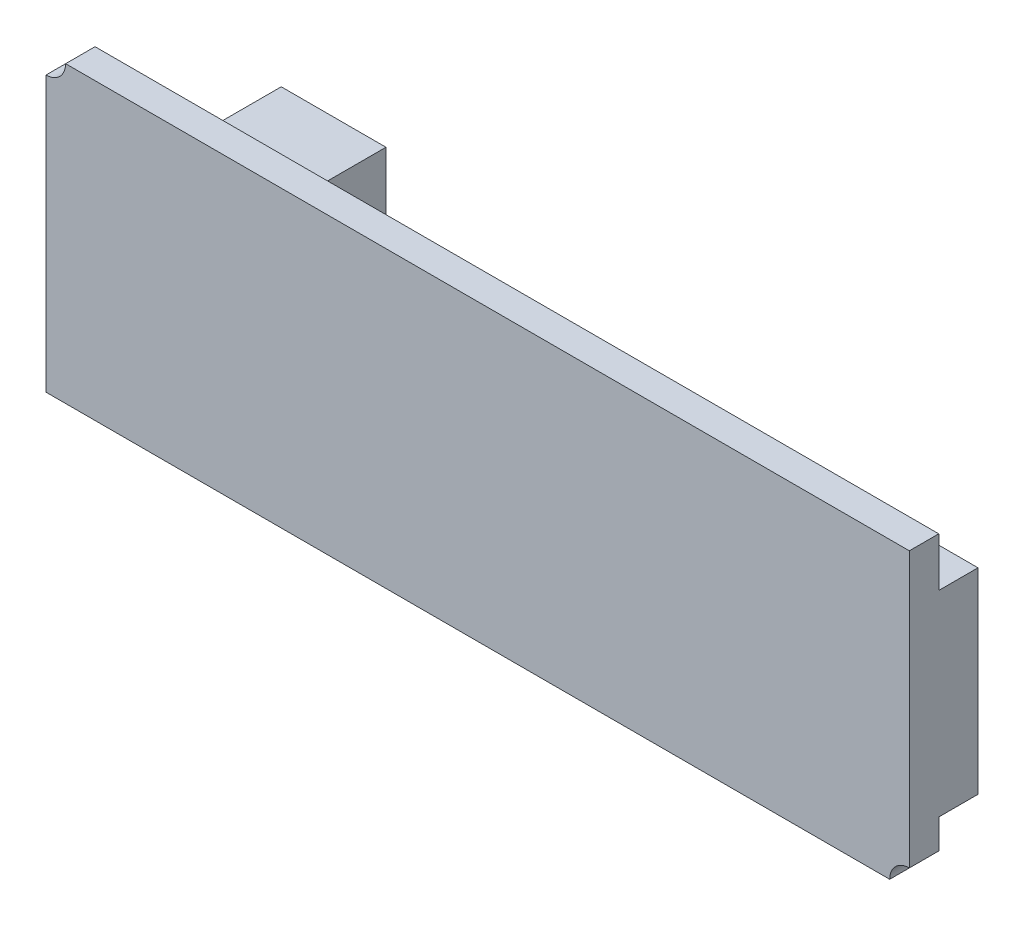
ISO-10303-21;
HEADER;
FILE_DESCRIPTION(('STEP AP214'),'2;1');
FILE_NAME('part.step','',(''),(''),'','','');
FILE_SCHEMA(('AUTOMOTIVE_DESIGN { 1 0 10303 214 1 1 1 1 }'));
ENDSEC;
DATA;
#1=APPLICATION_CONTEXT('core data for automotive mechanical design processes');
#2=APPLICATION_PROTOCOL_DEFINITION('international standard','automotive_design',2000,#1);
#3=PRODUCT_CONTEXT('',#1,'mechanical');
#4=PRODUCT('Part','Part','',(#3));
#5=PRODUCT_RELATED_PRODUCT_CATEGORY('part','',(#4));
#6=PRODUCT_DEFINITION_FORMATION('','',#4);
#7=PRODUCT_DEFINITION_CONTEXT('part definition',#1,'design');
#8=PRODUCT_DEFINITION('design','',#6,#7);
#9=PRODUCT_DEFINITION_SHAPE('','',#8);
#10=(LENGTH_UNIT() NAMED_UNIT(*) SI_UNIT(.MILLI.,.METRE.));
#11=(NAMED_UNIT(*) PLANE_ANGLE_UNIT() SI_UNIT($,.RADIAN.));
#12=(NAMED_UNIT(*) SI_UNIT($,.STERADIAN.) SOLID_ANGLE_UNIT());
#13=UNCERTAINTY_MEASURE_WITH_UNIT(LENGTH_MEASURE(1.E-05),#10,'distance_accuracy_value','');
#14=(GEOMETRIC_REPRESENTATION_CONTEXT(3) GLOBAL_UNCERTAINTY_ASSIGNED_CONTEXT((#13)) GLOBAL_UNIT_ASSIGNED_CONTEXT((#10,
#11,#12)) REPRESENTATION_CONTEXT('',''));
#15=CARTESIAN_POINT('',(0.,0.,0.));
#16=DIRECTION('',(0.,0.,1.));
#17=DIRECTION('',(1.,0.,0.));
#18=AXIS2_PLACEMENT_3D('',#15,#16,#17);
#19=CARTESIAN_POINT('',(0.,0.,1.5));
#20=DIRECTION('',(1.,0.,0.));
#21=DIRECTION('',(0.,0.,-1.));
#22=AXIS2_PLACEMENT_3D('',#19,#20,#21);
#23=PLANE('',#22);
#24=DIRECTION('',(0.,-1.,0.));
#25=VECTOR('',#24,1.);
#26=CARTESIAN_POINT('',(0.,0.,1.5));
#27=LINE('',#26,#25);
#28=CARTESIAN_POINT('',(0.,14.,1.5));
#29=VERTEX_POINT('',#28);
#30=CARTESIAN_POINT('',(0.,0.,1.5));
#31=VERTEX_POINT('',#30);
#32=EDGE_CURVE('E230',#29,#31,#27,.T.);
#33=ORIENTED_EDGE('',*,*,#32,.F.);
#34=DIRECTION('',(0.,0.,1.));
#35=VECTOR('',#34,1.);
#36=CARTESIAN_POINT('',(0.,14.,-2.001));
#37=LINE('',#36,#35);
#38=CARTESIAN_POINT('',(0.,14.,0.));
#39=VERTEX_POINT('',#38);
#40=EDGE_CURVE('E197',#39,#29,#37,.T.);
#41=ORIENTED_EDGE('',*,*,#40,.F.);
#42=DIRECTION('',(0.,-1.,0.));
#43=VECTOR('',#42,1.);
#44=CARTESIAN_POINT('',(0.,0.,0.));
#45=LINE('',#44,#43);
#46=CARTESIAN_POINT('',(0.,0.,0.));
#47=VERTEX_POINT('',#46);
#48=EDGE_CURVE('E229',#39,#47,#45,.T.);
#49=ORIENTED_EDGE('',*,*,#48,.T.);
#50=DIRECTION('',(0.,0.,-1.));
#51=VECTOR('',#50,1.);
#52=CARTESIAN_POINT('',(0.,0.,1.5));
#53=LINE('',#52,#51);
#54=EDGE_CURVE('E11',#31,#47,#53,.T.);
#55=ORIENTED_EDGE('',*,*,#54,.F.);
#56=EDGE_LOOP('',(#33,#41,#49,#55));
#57=FACE_BOUND('',#56,.T.);
#58=ADVANCED_FACE('F45',(#57),#23,.F.);
#59=CARTESIAN_POINT('',(0.,0.,1.5));
#60=DIRECTION('',(0.,1.,0.));
#61=DIRECTION('',(0.,0.,1.));
#62=AXIS2_PLACEMENT_3D('',#59,#60,#61);
#63=PLANE('',#62);
#64=DIRECTION('',(1.,0.,0.));
#65=VECTOR('',#64,1.);
#66=CARTESIAN_POINT('',(0.,0.,0.));
#67=LINE('',#66,#65);
#68=CARTESIAN_POINT('',(43.,0.,0.));
#69=VERTEX_POINT('',#68);
#70=EDGE_CURVE('E242',#47,#69,#67,.T.);
#71=ORIENTED_EDGE('',*,*,#70,.T.);
#72=DIRECTION('',(0.,0.,1.));
#73=VECTOR('',#72,1.);
#74=CARTESIAN_POINT('',(43.,0.,-2.001));
#75=LINE('',#74,#73);
#76=CARTESIAN_POINT('',(43.,0.,1.5));
#77=VERTEX_POINT('',#76);
#78=EDGE_CURVE('E186',#77,#69,#75,.F.);
#79=ORIENTED_EDGE('',*,*,#78,.F.);
#80=DIRECTION('',(1.,0.,0.));
#81=VECTOR('',#80,1.);
#82=CARTESIAN_POINT('',(0.,0.,1.5));
#83=LINE('',#82,#81);
#84=EDGE_CURVE('E232',#31,#77,#83,.T.);
#85=ORIENTED_EDGE('',*,*,#84,.F.);
#86=ORIENTED_EDGE('',*,*,#54,.T.);
#87=EDGE_LOOP('',(#71,#79,#85,#86));
#88=FACE_BOUND('',#87,.T.);
#89=ADVANCED_FACE('F273',(#88),#63,.F.);
#90=CARTESIAN_POINT('',(44.,0.,1.5));
#91=DIRECTION('',(-1.,0.,0.));
#92=DIRECTION('',(0.,0.,1.));
#93=AXIS2_PLACEMENT_3D('',#90,#91,#92);
#94=PLANE('',#93);
#95=DIRECTION('',(0.,1.,0.));
#96=VECTOR('',#95,1.);
#97=CARTESIAN_POINT('',(44.,0.,1.5));
#98=LINE('',#97,#96);
#99=CARTESIAN_POINT('',(44.,0.999999999999998,1.5));
#100=VERTEX_POINT('',#99);
#101=CARTESIAN_POINT('',(44.,15.,1.5));
#102=VERTEX_POINT('',#101);
#103=EDGE_CURVE('E236',#100,#102,#98,.T.);
#104=ORIENTED_EDGE('',*,*,#103,.F.);
#105=DIRECTION('',(0.,0.,1.));
#106=VECTOR('',#105,1.);
#107=CARTESIAN_POINT('',(44.,0.999999999999998,-2.001));
#108=LINE('',#107,#106);
#109=CARTESIAN_POINT('',(44.,0.999999999999998,0.));
#110=VERTEX_POINT('',#109);
#111=EDGE_CURVE('E184',#110,#100,#108,.T.);
#112=ORIENTED_EDGE('',*,*,#111,.F.);
#113=DIRECTION('',(0.,1.,0.));
#114=VECTOR('',#113,1.);
#115=CARTESIAN_POINT('',(44.,0.,0.));
#116=LINE('',#115,#114);
#117=CARTESIAN_POINT('',(44.,2.5,0.));
#118=VERTEX_POINT('',#117);
#119=EDGE_CURVE('E246',#110,#118,#116,.T.);
#120=ORIENTED_EDGE('',*,*,#119,.T.);
#121=DIRECTION('',(0.,0.,1.));
#122=VECTOR('',#121,1.);
#123=CARTESIAN_POINT('',(44.,2.5,-2.));
#124=LINE('',#123,#122);
#125=CARTESIAN_POINT('',(44.,2.5,-2.));
#126=VERTEX_POINT('',#125);
#127=EDGE_CURVE('E226',#126,#118,#124,.T.);
#128=ORIENTED_EDGE('',*,*,#127,.F.);
#129=DIRECTION('',(0.,-1.,0.));
#130=VECTOR('',#129,1.);
#131=CARTESIAN_POINT('',(44.,12.5,-2.));
#132=LINE('',#131,#130);
#133=CARTESIAN_POINT('',(44.,12.5,-2.));
#134=VERTEX_POINT('',#133);
#135=EDGE_CURVE('E200',#134,#126,#132,.T.);
#136=ORIENTED_EDGE('',*,*,#135,.F.);
#137=DIRECTION('',(0.,0.,1.));
#138=VECTOR('',#137,1.);
#139=CARTESIAN_POINT('',(44.,12.5,-2.));
#140=LINE('',#139,#138);
#141=CARTESIAN_POINT('',(44.,12.5,0.));
#142=VERTEX_POINT('',#141);
#143=EDGE_CURVE('E210',#134,#142,#140,.T.);
#144=ORIENTED_EDGE('',*,*,#143,.T.);
#145=CARTESIAN_POINT('',(44.,15.,0.));
#146=VERTEX_POINT('',#145);
#147=EDGE_CURVE('E245',#142,#146,#116,.T.);
#148=ORIENTED_EDGE('',*,*,#147,.T.);
#149=DIRECTION('',(0.,0.,-1.));
#150=VECTOR('',#149,1.);
#151=CARTESIAN_POINT('',(44.,15.,1.5));
#152=LINE('',#151,#150);
#153=EDGE_CURVE('E52',#102,#146,#152,.T.);
#154=ORIENTED_EDGE('',*,*,#153,.F.);
#155=EDGE_LOOP('',(#104,#112,#120,#128,#136,#144,#148,#154));
#156=FACE_BOUND('',#155,.T.);
#157=ADVANCED_FACE('F280',(#156),#94,.F.);
#158=CARTESIAN_POINT('',(0.,15.,1.5));
#159=DIRECTION('',(0.,-1.,0.));
#160=DIRECTION('',(0.,0.,-1.));
#161=AXIS2_PLACEMENT_3D('',#158,#159,#160);
#162=PLANE('',#161);
#163=DIRECTION('',(-1.,0.,0.));
#164=VECTOR('',#163,1.);
#165=CARTESIAN_POINT('',(0.,15.,0.));
#166=LINE('',#165,#164);
#167=CARTESIAN_POINT('',(1.,15.,0.));
#168=VERTEX_POINT('',#167);
#169=EDGE_CURVE('E233',#146,#168,#166,.T.);
#170=ORIENTED_EDGE('',*,*,#169,.T.);
#171=DIRECTION('',(0.,0.,1.));
#172=VECTOR('',#171,1.);
#173=CARTESIAN_POINT('',(1.,15.,-2.001));
#174=LINE('',#173,#172);
#175=CARTESIAN_POINT('',(1.,15.,1.5));
#176=VERTEX_POINT('',#175);
#177=EDGE_CURVE('E67',#176,#168,#174,.F.);
#178=ORIENTED_EDGE('',*,*,#177,.F.);
#179=DIRECTION('',(-1.,0.,0.));
#180=VECTOR('',#179,1.);
#181=CARTESIAN_POINT('',(0.,15.,1.5));
#182=LINE('',#181,#180);
#183=EDGE_CURVE('E238',#102,#176,#182,.T.);
#184=ORIENTED_EDGE('',*,*,#183,.F.);
#185=ORIENTED_EDGE('',*,*,#153,.T.);
#186=EDGE_LOOP('',(#170,#178,#184,#185));
#187=FACE_BOUND('',#186,.T.);
#188=ADVANCED_FACE('F254',(#187),#162,.F.);
#189=CARTESIAN_POINT('',(0.,0.,1.5));
#190=DIRECTION('',(0.,0.,-1.));
#191=DIRECTION('',(-1.,0.,0.));
#192=AXIS2_PLACEMENT_3D('',#189,#190,#191);
#193=PLANE('',#192);
#194=ORIENTED_EDGE('',*,*,#84,.T.);
#195=CARTESIAN_POINT('',(44.,0.,1.5));
#196=DIRECTION('',(0.,0.,1.));
#197=DIRECTION('',(1.,0.,0.));
#198=AXIS2_PLACEMENT_3D('',#195,#196,#197);
#199=CIRCLE('',#198,0.999999999999998);
#200=EDGE_CURVE('E188',#100,#77,#199,.T.);
#201=ORIENTED_EDGE('',*,*,#200,.F.);
#202=ORIENTED_EDGE('',*,*,#103,.T.);
#203=ORIENTED_EDGE('',*,*,#183,.T.);
#204=CARTESIAN_POINT('',(0.,15.,1.5));
#205=DIRECTION('',(0.,0.,1.));
#206=DIRECTION('',(1.,0.,0.));
#207=AXIS2_PLACEMENT_3D('',#204,#205,#206);
#208=CIRCLE('',#207,1.);
#209=EDGE_CURVE('E195',#29,#176,#208,.T.);
#210=ORIENTED_EDGE('',*,*,#209,.F.);
#211=ORIENTED_EDGE('',*,*,#32,.T.);
#212=EDGE_LOOP('',(#194,#201,#202,#203,#210,#211));
#213=FACE_BOUND('',#212,.T.);
#214=ADVANCED_FACE('F269',(#213),#193,.F.);
#215=CARTESIAN_POINT('',(0.,0.,0.));
#216=DIRECTION('',(0.,0.,-1.));
#217=DIRECTION('',(-1.,0.,0.));
#218=AXIS2_PLACEMENT_3D('',#215,#216,#217);
#219=PLANE('',#218);
#220=DIRECTION('',(1.,0.,0.));
#221=VECTOR('',#220,1.);
#222=CARTESIAN_POINT('',(4.48921183664197,2.82929884240524,0.));
#223=LINE('',#222,#221);
#224=CARTESIAN_POINT('',(4.48921183664197,2.82929884240524,0.));
#225=VERTEX_POINT('',#224);
#226=CARTESIAN_POINT('',(9.82587689526326,2.82929884240524,0.));
#227=VERTEX_POINT('',#226);
#228=EDGE_CURVE('E175',#225,#227,#223,.T.);
#229=ORIENTED_EDGE('',*,*,#228,.T.);
#230=DIRECTION('',(0.,-1.,0.));
#231=VECTOR('',#230,1.);
#232=CARTESIAN_POINT('',(9.82587689526326,11.9753104794338,0.));
#233=LINE('',#232,#231);
#234=CARTESIAN_POINT('',(9.82587689526326,11.9753104794338,0.));
#235=VERTEX_POINT('',#234);
#236=EDGE_CURVE('E159',#235,#227,#233,.T.);
#237=ORIENTED_EDGE('',*,*,#236,.F.);
#238=DIRECTION('',(1.,0.,0.));
#239=VECTOR('',#238,1.);
#240=CARTESIAN_POINT('',(4.48921183664197,11.9753104794338,0.));
#241=LINE('',#240,#239);
#242=CARTESIAN_POINT('',(4.48921183664197,11.9753104794338,0.));
#243=VERTEX_POINT('',#242);
#244=EDGE_CURVE('E170',#243,#235,#241,.T.);
#245=ORIENTED_EDGE('',*,*,#244,.F.);
#246=DIRECTION('',(0.,-1.,0.));
#247=VECTOR('',#246,1.);
#248=CARTESIAN_POINT('',(4.48921183664197,11.9753104794338,0.));
#249=LINE('',#248,#247);
#250=EDGE_CURVE('E167',#243,#225,#249,.T.);
#251=ORIENTED_EDGE('',*,*,#250,.T.);
#252=EDGE_LOOP('',(#229,#237,#245,#251));
#253=FACE_BOUND('',#252,.T.);
#254=CARTESIAN_POINT('',(44.,0.,0.));
#255=DIRECTION('',(0.,0.,-1.));
#256=DIRECTION('',(-1.,0.,0.));
#257=AXIS2_PLACEMENT_3D('',#254,#255,#256);
#258=CIRCLE('',#257,0.999999999999998);
#259=EDGE_CURVE('E190',#110,#69,#258,.F.);
#260=ORIENTED_EDGE('',*,*,#259,.T.);
#261=ORIENTED_EDGE('',*,*,#70,.F.);
#262=ORIENTED_EDGE('',*,*,#48,.F.);
#263=CARTESIAN_POINT('',(0.,15.,0.));
#264=DIRECTION('',(0.,0.,-1.));
#265=DIRECTION('',(-1.,0.,0.));
#266=AXIS2_PLACEMENT_3D('',#263,#264,#265);
#267=CIRCLE('',#266,1.);
#268=EDGE_CURVE('E180',#39,#168,#267,.F.);
#269=ORIENTED_EDGE('',*,*,#268,.T.);
#270=ORIENTED_EDGE('',*,*,#169,.F.);
#271=ORIENTED_EDGE('',*,*,#147,.F.);
#272=DIRECTION('',(1.,0.,0.));
#273=VECTOR('',#272,1.);
#274=CARTESIAN_POINT('',(44.,12.5,0.));
#275=LINE('',#274,#273);
#276=CARTESIAN_POINT('',(38.,12.5,0.));
#277=VERTEX_POINT('',#276);
#278=EDGE_CURVE('E204',#277,#142,#275,.T.);
#279=ORIENTED_EDGE('',*,*,#278,.F.);
#280=DIRECTION('',(0.,1.,0.));
#281=VECTOR('',#280,1.);
#282=CARTESIAN_POINT('',(38.,12.5,0.));
#283=LINE('',#282,#281);
#284=CARTESIAN_POINT('',(38.,2.5,0.));
#285=VERTEX_POINT('',#284);
#286=EDGE_CURVE('E213',#285,#277,#283,.T.);
#287=ORIENTED_EDGE('',*,*,#286,.F.);
#288=DIRECTION('',(-1.,0.,0.));
#289=VECTOR('',#288,1.);
#290=CARTESIAN_POINT('',(44.,2.5,0.));
#291=LINE('',#290,#289);
#292=EDGE_CURVE('E193',#118,#285,#291,.T.);
#293=ORIENTED_EDGE('',*,*,#292,.F.);
#294=ORIENTED_EDGE('',*,*,#119,.F.);
#295=EDGE_LOOP('',(#260,#261,#262,#269,#270,#271,#279,#287,#293,#294));
#296=FACE_BOUND('',#295,.T.);
#297=ADVANCED_FACE('F258',(#253,#296),#219,.T.);
#298=CARTESIAN_POINT('',(44.,2.5,-2.));
#299=DIRECTION('',(0.,1.,0.));
#300=DIRECTION('',(0.,0.,1.));
#301=AXIS2_PLACEMENT_3D('',#298,#299,#300);
#302=PLANE('',#301);
#303=ORIENTED_EDGE('',*,*,#292,.T.);
#304=DIRECTION('',(0.,0.,1.));
#305=VECTOR('',#304,1.);
#306=CARTESIAN_POINT('',(38.,2.5,-2.));
#307=LINE('',#306,#305);
#308=CARTESIAN_POINT('',(38.,2.5,-2.));
#309=VERTEX_POINT('',#308);
#310=EDGE_CURVE('E223',#309,#285,#307,.T.);
#311=ORIENTED_EDGE('',*,*,#310,.F.);
#312=DIRECTION('',(-1.,0.,0.));
#313=VECTOR('',#312,1.);
#314=CARTESIAN_POINT('',(44.,2.5,-2.));
#315=LINE('',#314,#313);
#316=EDGE_CURVE('E203',#126,#309,#315,.T.);
#317=ORIENTED_EDGE('',*,*,#316,.F.);
#318=ORIENTED_EDGE('',*,*,#127,.T.);
#319=EDGE_LOOP('',(#303,#311,#317,#318));
#320=FACE_BOUND('',#319,.T.);
#321=ADVANCED_FACE('F283',(#320),#302,.F.);
#322=CARTESIAN_POINT('',(38.,12.5,-2.));
#323=DIRECTION('',(1.,0.,0.));
#324=DIRECTION('',(0.,0.,-1.));
#325=AXIS2_PLACEMENT_3D('',#322,#323,#324);
#326=PLANE('',#325);
#327=ORIENTED_EDGE('',*,*,#286,.T.);
#328=DIRECTION('',(0.,0.,1.));
#329=VECTOR('',#328,1.);
#330=CARTESIAN_POINT('',(38.,12.5,-2.));
#331=LINE('',#330,#329);
#332=CARTESIAN_POINT('',(38.,12.5,-2.));
#333=VERTEX_POINT('',#332);
#334=EDGE_CURVE('E220',#333,#277,#331,.T.);
#335=ORIENTED_EDGE('',*,*,#334,.F.);
#336=DIRECTION('',(0.,1.,0.));
#337=VECTOR('',#336,1.);
#338=CARTESIAN_POINT('',(38.,12.5,-2.));
#339=LINE('',#338,#337);
#340=EDGE_CURVE('E206',#309,#333,#339,.T.);
#341=ORIENTED_EDGE('',*,*,#340,.F.);
#342=ORIENTED_EDGE('',*,*,#310,.T.);
#343=EDGE_LOOP('',(#327,#335,#341,#342));
#344=FACE_BOUND('',#343,.T.);
#345=ADVANCED_FACE('F294',(#344),#326,.F.);
#346=CARTESIAN_POINT('',(44.,12.5,-2.));
#347=DIRECTION('',(0.,-1.,0.));
#348=DIRECTION('',(0.,0.,-1.));
#349=AXIS2_PLACEMENT_3D('',#346,#347,#348);
#350=PLANE('',#349);
#351=ORIENTED_EDGE('',*,*,#278,.T.);
#352=ORIENTED_EDGE('',*,*,#143,.F.);
#353=DIRECTION('',(1.,0.,0.));
#354=VECTOR('',#353,1.);
#355=CARTESIAN_POINT('',(44.,12.5,-2.));
#356=LINE('',#355,#354);
#357=EDGE_CURVE('E208',#333,#134,#356,.T.);
#358=ORIENTED_EDGE('',*,*,#357,.F.);
#359=ORIENTED_EDGE('',*,*,#334,.T.);
#360=EDGE_LOOP('',(#351,#352,#358,#359));
#361=FACE_BOUND('',#360,.T.);
#362=ADVANCED_FACE('F292',(#361),#350,.F.);
#363=CARTESIAN_POINT('',(0.,0.,-2.));
#364=DIRECTION('',(0.,0.,-1.));
#365=DIRECTION('',(-1.,0.,0.));
#366=AXIS2_PLACEMENT_3D('',#363,#364,#365);
#367=PLANE('',#366);
#368=ORIENTED_EDGE('',*,*,#135,.T.);
#369=ORIENTED_EDGE('',*,*,#316,.T.);
#370=ORIENTED_EDGE('',*,*,#340,.T.);
#371=ORIENTED_EDGE('',*,*,#357,.T.);
#372=EDGE_LOOP('',(#368,#369,#370,#371));
#373=FACE_BOUND('',#372,.T.);
#374=ADVANCED_FACE('F287',(#373),#367,.T.);
#375=CARTESIAN_POINT('',(0.,15.,-2.001));
#376=DIRECTION('',(0.,0.,1.));
#377=DIRECTION('',(1.,0.,0.));
#378=AXIS2_PLACEMENT_3D('',#375,#376,#377);
#379=CYLINDRICAL_SURFACE('',#378,1.);
#380=ORIENTED_EDGE('',*,*,#40,.T.);
#381=ORIENTED_EDGE('',*,*,#209,.T.);
#382=ORIENTED_EDGE('',*,*,#177,.T.);
#383=ORIENTED_EDGE('',*,*,#268,.F.);
#384=EDGE_LOOP('',(#380,#381,#382,#383));
#385=FACE_BOUND('',#384,.T.);
#386=ADVANCED_FACE('F262',(#385),#379,.F.);
#387=CARTESIAN_POINT('',(44.,0.,-2.001));
#388=DIRECTION('',(0.,0.,1.));
#389=DIRECTION('',(1.,0.,0.));
#390=AXIS2_PLACEMENT_3D('',#387,#388,#389);
#391=CYLINDRICAL_SURFACE('',#390,0.999999999999998);
#392=ORIENTED_EDGE('',*,*,#78,.T.);
#393=ORIENTED_EDGE('',*,*,#259,.F.);
#394=ORIENTED_EDGE('',*,*,#111,.T.);
#395=ORIENTED_EDGE('',*,*,#200,.T.);
#396=EDGE_LOOP('',(#392,#393,#394,#395));
#397=FACE_BOUND('',#396,.T.);
#398=ADVANCED_FACE('F275',(#397),#391,.F.);
#399=CARTESIAN_POINT('',(4.48921183664197,2.82929884240524,-6.));
#400=DIRECTION('',(0.,-1.,0.));
#401=DIRECTION('',(0.,0.,-1.));
#402=AXIS2_PLACEMENT_3D('',#399,#400,#401);
#403=PLANE('',#402);
#404=ORIENTED_EDGE('',*,*,#228,.F.);
#405=DIRECTION('',(0.,0.,1.));
#406=VECTOR('',#405,1.);
#407=CARTESIAN_POINT('',(4.48921183664197,2.82929884240524,-6.));
#408=LINE('',#407,#406);
#409=CARTESIAN_POINT('',(4.48921183664197,2.82929884240524,-6.));
#410=VERTEX_POINT('',#409);
#411=EDGE_CURVE('E166',#410,#225,#408,.T.);
#412=ORIENTED_EDGE('',*,*,#411,.F.);
#413=DIRECTION('',(1.,0.,0.));
#414=VECTOR('',#413,1.);
#415=CARTESIAN_POINT('',(4.48921183664197,2.82929884240524,-6.));
#416=LINE('',#415,#414);
#417=CARTESIAN_POINT('',(9.82587689526326,2.82929884240524,-6.));
#418=VERTEX_POINT('',#417);
#419=EDGE_CURVE('E151',#410,#418,#416,.T.);
#420=ORIENTED_EDGE('',*,*,#419,.T.);
#421=DIRECTION('',(0.,0.,1.));
#422=VECTOR('',#421,1.);
#423=CARTESIAN_POINT('',(9.82587689526326,2.82929884240524,-6.));
#424=LINE('',#423,#422);
#425=EDGE_CURVE('E156',#418,#227,#424,.T.);
#426=ORIENTED_EDGE('',*,*,#425,.T.);
#427=EDGE_LOOP('',(#404,#412,#420,#426));
#428=FACE_BOUND('',#427,.T.);
#429=ADVANCED_FACE('F165',(#428),#403,.T.);
#430=CARTESIAN_POINT('',(4.48921183664197,11.9753104794338,-6.));
#431=DIRECTION('',(-1.,0.,0.));
#432=DIRECTION('',(0.,0.,1.));
#433=AXIS2_PLACEMENT_3D('',#430,#431,#432);
#434=PLANE('',#433);
#435=ORIENTED_EDGE('',*,*,#250,.F.);
#436=DIRECTION('',(0.,0.,1.));
#437=VECTOR('',#436,1.);
#438=CARTESIAN_POINT('',(4.48921183664197,11.9753104794338,-6.));
#439=LINE('',#438,#437);
#440=CARTESIAN_POINT('',(4.48921183664197,11.9753104794338,-6.));
#441=VERTEX_POINT('',#440);
#442=EDGE_CURVE('E181',#441,#243,#439,.T.);
#443=ORIENTED_EDGE('',*,*,#442,.F.);
#444=DIRECTION('',(0.,-1.,0.));
#445=VECTOR('',#444,1.);
#446=CARTESIAN_POINT('',(4.48921183664197,11.9753104794338,-6.));
#447=LINE('',#446,#445);
#448=EDGE_CURVE('E163',#441,#410,#447,.T.);
#449=ORIENTED_EDGE('',*,*,#448,.T.);
#450=ORIENTED_EDGE('',*,*,#411,.T.);
#451=EDGE_LOOP('',(#435,#443,#449,#450));
#452=FACE_BOUND('',#451,.T.);
#453=ADVANCED_FACE('F351',(#452),#434,.T.);
#454=CARTESIAN_POINT('',(4.48921183664197,11.9753104794338,-6.));
#455=DIRECTION('',(0.,-1.,0.));
#456=DIRECTION('',(0.,0.,-1.));
#457=AXIS2_PLACEMENT_3D('',#454,#455,#456);
#458=PLANE('',#457);
#459=ORIENTED_EDGE('',*,*,#244,.T.);
#460=DIRECTION('',(0.,0.,1.));
#461=VECTOR('',#460,1.);
#462=CARTESIAN_POINT('',(9.82587689526326,11.9753104794338,-6.));
#463=LINE('',#462,#461);
#464=CARTESIAN_POINT('',(9.82587689526326,11.9753104794338,-6.));
#465=VERTEX_POINT('',#464);
#466=EDGE_CURVE('E59',#465,#235,#463,.T.);
#467=ORIENTED_EDGE('',*,*,#466,.F.);
#468=DIRECTION('',(1.,0.,0.));
#469=VECTOR('',#468,1.);
#470=CARTESIAN_POINT('',(4.48921183664197,11.9753104794338,-6.));
#471=LINE('',#470,#469);
#472=EDGE_CURVE('E154',#441,#465,#471,.T.);
#473=ORIENTED_EDGE('',*,*,#472,.F.);
#474=ORIENTED_EDGE('',*,*,#442,.T.);
#475=EDGE_LOOP('',(#459,#467,#473,#474));
#476=FACE_BOUND('',#475,.T.);
#477=ADVANCED_FACE('F359',(#476),#458,.F.);
#478=CARTESIAN_POINT('',(9.82587689526326,11.9753104794338,-6.));
#479=DIRECTION('',(-1.,0.,0.));
#480=DIRECTION('',(0.,0.,1.));
#481=AXIS2_PLACEMENT_3D('',#478,#479,#480);
#482=PLANE('',#481);
#483=ORIENTED_EDGE('',*,*,#236,.T.);
#484=ORIENTED_EDGE('',*,*,#425,.F.);
#485=DIRECTION('',(0.,-1.,0.));
#486=VECTOR('',#485,1.);
#487=CARTESIAN_POINT('',(9.82587689526326,11.9753104794338,-6.));
#488=LINE('',#487,#486);
#489=EDGE_CURVE('E146',#465,#418,#488,.T.);
#490=ORIENTED_EDGE('',*,*,#489,.F.);
#491=ORIENTED_EDGE('',*,*,#466,.T.);
#492=EDGE_LOOP('',(#483,#484,#490,#491));
#493=FACE_BOUND('',#492,.T.);
#494=ADVANCED_FACE('F157',(#493),#482,.F.);
#495=CARTESIAN_POINT('',(0.,0.,-6.));
#496=DIRECTION('',(0.,0.,-1.));
#497=DIRECTION('',(-1.,0.,0.));
#498=AXIS2_PLACEMENT_3D('',#495,#496,#497);
#499=PLANE('',#498);
#500=ORIENTED_EDGE('',*,*,#419,.F.);
#501=ORIENTED_EDGE('',*,*,#448,.F.);
#502=ORIENTED_EDGE('',*,*,#472,.T.);
#503=ORIENTED_EDGE('',*,*,#489,.T.);
#504=EDGE_LOOP('',(#500,#501,#502,#503));
#505=FACE_BOUND('',#504,.T.);
#506=ADVANCED_FACE('F148',(#505),#499,.T.);
#507=CLOSED_SHELL('',(#58,#89,#157,#188,#214,#297,#321,#345,#362,#374,#386,#398,#429,#453,#477,
#494,#506));
#508=MANIFOLD_SOLID_BREP('B2',#507);
#509=ADVANCED_BREP_SHAPE_REPRESENTATION('',(#18,#508),#14);
#510=SHAPE_DEFINITION_REPRESENTATION(#9,#509);
ENDSEC;
END-ISO-10303-21;
